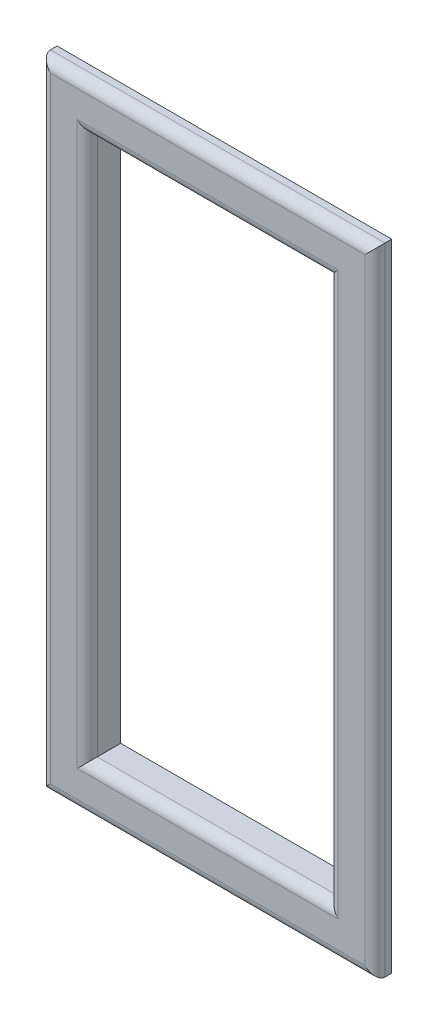
ISO-10303-21;
HEADER;
FILE_DESCRIPTION(('STEP AP214'),'2;1');
FILE_NAME('part.step','',(''),(''),'','','');
FILE_SCHEMA(('AUTOMOTIVE_DESIGN { 1 0 10303 214 1 1 1 1 }'));
ENDSEC;
DATA;
#1=APPLICATION_CONTEXT('core data for automotive mechanical design processes');
#2=APPLICATION_PROTOCOL_DEFINITION('international standard','automotive_design',2000,#1);
#3=PRODUCT_CONTEXT('',#1,'mechanical');
#4=PRODUCT('Part','Part','',(#3));
#5=PRODUCT_RELATED_PRODUCT_CATEGORY('part','',(#4));
#6=PRODUCT_DEFINITION_FORMATION('','',#4);
#7=PRODUCT_DEFINITION_CONTEXT('part definition',#1,'design');
#8=PRODUCT_DEFINITION('design','',#6,#7);
#9=PRODUCT_DEFINITION_SHAPE('','',#8);
#10=(LENGTH_UNIT() NAMED_UNIT(*) SI_UNIT(.MILLI.,.METRE.));
#11=(NAMED_UNIT(*) PLANE_ANGLE_UNIT() SI_UNIT($,.RADIAN.));
#12=(NAMED_UNIT(*) SI_UNIT($,.STERADIAN.) SOLID_ANGLE_UNIT());
#13=UNCERTAINTY_MEASURE_WITH_UNIT(LENGTH_MEASURE(1.E-05),#10,'distance_accuracy_value','');
#14=(GEOMETRIC_REPRESENTATION_CONTEXT(3) GLOBAL_UNCERTAINTY_ASSIGNED_CONTEXT((#13)) GLOBAL_UNIT_ASSIGNED_CONTEXT((#10,
#11,#12)) REPRESENTATION_CONTEXT('',''));
#15=CARTESIAN_POINT('',(0.,0.,0.));
#16=DIRECTION('',(0.,0.,1.));
#17=DIRECTION('',(1.,0.,0.));
#18=AXIS2_PLACEMENT_3D('',#15,#16,#17);
#19=CARTESIAN_POINT('',(-20.,-42.5,2.5));
#20=DIRECTION('',(1.,0.,0.));
#21=DIRECTION('',(0.,0.,-1.));
#22=AXIS2_PLACEMENT_3D('',#19,#20,#21);
#23=PLANE('',#22);
#24=DIRECTION('',(0.,-1.,0.));
#25=VECTOR('',#24,1.);
#26=CARTESIAN_POINT('',(-20.,-42.5,0.));
#27=LINE('',#26,#25);
#28=CARTESIAN_POINT('',(-20.,42.5,0.));
#29=VERTEX_POINT('',#28);
#30=CARTESIAN_POINT('',(-20.,-42.5,0.));
#31=VERTEX_POINT('',#30);
#32=EDGE_CURVE('E321',#29,#31,#27,.T.);
#33=ORIENTED_EDGE('',*,*,#32,.F.);
#34=DIRECTION('',(0.,0.,-1.));
#35=VECTOR('',#34,1.);
#36=CARTESIAN_POINT('',(-20.,42.5,2.5));
#37=LINE('',#36,#35);
#38=CARTESIAN_POINT('',(-20.,42.5,-2.5));
#39=VERTEX_POINT('',#38);
#40=EDGE_CURVE('E248',#29,#39,#37,.T.);
#41=ORIENTED_EDGE('',*,*,#40,.T.);
#42=DIRECTION('',(0.,-1.,0.));
#43=VECTOR('',#42,1.);
#44=CARTESIAN_POINT('',(-20.,-42.5,-2.5));
#45=LINE('',#44,#43);
#46=CARTESIAN_POINT('',(-20.,-42.5,-2.5));
#47=VERTEX_POINT('',#46);
#48=EDGE_CURVE('E232',#39,#47,#45,.T.);
#49=ORIENTED_EDGE('',*,*,#48,.T.);
#50=DIRECTION('',(0.,0.,-1.));
#51=VECTOR('',#50,1.);
#52=CARTESIAN_POINT('',(-20.,-42.5,2.5));
#53=LINE('',#52,#51);
#54=EDGE_CURVE('E257',#31,#47,#53,.T.);
#55=ORIENTED_EDGE('',*,*,#54,.F.);
#56=EDGE_LOOP('',(#33,#41,#49,#55));
#57=FACE_BOUND('',#56,.T.);
#58=ADVANCED_FACE('F45',(#57),#23,.F.);
#59=CARTESIAN_POINT('',(20.,-42.5,2.5));
#60=DIRECTION('',(0.,1.,0.));
#61=DIRECTION('',(0.,0.,1.));
#62=AXIS2_PLACEMENT_3D('',#59,#60,#61);
#63=PLANE('',#62);
#64=DIRECTION('',(1.,0.,0.));
#65=VECTOR('',#64,1.);
#66=CARTESIAN_POINT('',(20.,-42.5,0.));
#67=LINE('',#66,#65);
#68=CARTESIAN_POINT('',(20.,-42.5,0.));
#69=VERTEX_POINT('',#68);
#70=EDGE_CURVE('E542',#31,#69,#67,.T.);
#71=ORIENTED_EDGE('',*,*,#70,.F.);
#72=ORIENTED_EDGE('',*,*,#54,.T.);
#73=DIRECTION('',(1.,0.,0.));
#74=VECTOR('',#73,1.);
#75=CARTESIAN_POINT('',(20.,-42.5,-2.5));
#76=LINE('',#75,#74);
#77=CARTESIAN_POINT('',(20.,-42.5,-2.5));
#78=VERTEX_POINT('',#77);
#79=EDGE_CURVE('E236',#47,#78,#76,.T.);
#80=ORIENTED_EDGE('',*,*,#79,.T.);
#81=DIRECTION('',(0.,0.,-1.));
#82=VECTOR('',#81,1.);
#83=CARTESIAN_POINT('',(20.,-42.5,2.5));
#84=LINE('',#83,#82);
#85=EDGE_CURVE('E254',#69,#78,#84,.T.);
#86=ORIENTED_EDGE('',*,*,#85,.F.);
#87=EDGE_LOOP('',(#71,#72,#80,#86));
#88=FACE_BOUND('',#87,.T.);
#89=ADVANCED_FACE('F371',(#88),#63,.F.);
#90=CARTESIAN_POINT('',(20.,-42.5,2.5));
#91=DIRECTION('',(-1.,0.,0.));
#92=DIRECTION('',(0.,0.,1.));
#93=AXIS2_PLACEMENT_3D('',#90,#91,#92);
#94=PLANE('',#93);
#95=DIRECTION('',(0.,1.,0.));
#96=VECTOR('',#95,1.);
#97=CARTESIAN_POINT('',(20.,-42.5,0.));
#98=LINE('',#97,#96);
#99=CARTESIAN_POINT('',(20.,42.5,0.));
#100=VERTEX_POINT('',#99);
#101=EDGE_CURVE('E189',#69,#100,#98,.T.);
#102=ORIENTED_EDGE('',*,*,#101,.F.);
#103=ORIENTED_EDGE('',*,*,#85,.T.);
#104=DIRECTION('',(0.,1.,0.));
#105=VECTOR('',#104,1.);
#106=CARTESIAN_POINT('',(20.,-42.5,-2.5));
#107=LINE('',#106,#105);
#108=CARTESIAN_POINT('',(20.,42.5,-2.5));
#109=VERTEX_POINT('',#108);
#110=EDGE_CURVE('E240',#78,#109,#107,.T.);
#111=ORIENTED_EDGE('',*,*,#110,.T.);
#112=DIRECTION('',(0.,0.,-1.));
#113=VECTOR('',#112,1.);
#114=CARTESIAN_POINT('',(20.,42.5,2.5));
#115=LINE('',#114,#113);
#116=EDGE_CURVE('E251',#100,#109,#115,.T.);
#117=ORIENTED_EDGE('',*,*,#116,.F.);
#118=EDGE_LOOP('',(#102,#103,#111,#117));
#119=FACE_BOUND('',#118,.T.);
#120=ADVANCED_FACE('F366',(#119),#94,.F.);
#121=CARTESIAN_POINT('',(20.,42.5,2.5));
#122=DIRECTION('',(0.,-1.,0.));
#123=DIRECTION('',(0.,0.,-1.));
#124=AXIS2_PLACEMENT_3D('',#121,#122,#123);
#125=PLANE('',#124);
#126=DIRECTION('',(-1.,0.,0.));
#127=VECTOR('',#126,1.);
#128=CARTESIAN_POINT('',(20.,42.5,0.));
#129=LINE('',#128,#127);
#130=EDGE_CURVE('E185',#100,#29,#129,.T.);
#131=ORIENTED_EDGE('',*,*,#130,.F.);
#132=ORIENTED_EDGE('',*,*,#116,.T.);
#133=DIRECTION('',(-1.,0.,0.));
#134=VECTOR('',#133,1.);
#135=CARTESIAN_POINT('',(20.,42.5,-2.5));
#136=LINE('',#135,#134);
#137=EDGE_CURVE('E244',#109,#39,#136,.T.);
#138=ORIENTED_EDGE('',*,*,#137,.T.);
#139=ORIENTED_EDGE('',*,*,#40,.F.);
#140=EDGE_LOOP('',(#131,#132,#138,#139));
#141=FACE_BOUND('',#140,.T.);
#142=ADVANCED_FACE('F354',(#141),#125,.F.);
#143=CARTESIAN_POINT('',(0.,0.,2.5));
#144=DIRECTION('',(0.,0.,1.));
#145=DIRECTION('',(1.,0.,0.));
#146=AXIS2_PLACEMENT_3D('',#143,#144,#145);
#147=PLANE('',#146);
#148=DIRECTION('',(0.,1.,0.));
#149=VECTOR('',#148,1.);
#150=CARTESIAN_POINT('',(19.5,0.,2.5));
#151=LINE('',#150,#149);
#152=CARTESIAN_POINT('',(19.5,42.,2.5));
#153=VERTEX_POINT('',#152);
#154=CARTESIAN_POINT('',(19.5,-42.,2.5));
#155=VERTEX_POINT('',#154);
#156=EDGE_CURVE('E283',#153,#155,#151,.F.);
#157=ORIENTED_EDGE('',*,*,#156,.T.);
#158=DIRECTION('',(1.,0.,0.));
#159=VECTOR('',#158,1.);
#160=CARTESIAN_POINT('',(0.,-42.,2.5));
#161=LINE('',#160,#159);
#162=CARTESIAN_POINT('',(-19.5,-42.,2.5));
#163=VERTEX_POINT('',#162);
#164=EDGE_CURVE('E286',#155,#163,#161,.F.);
#165=ORIENTED_EDGE('',*,*,#164,.T.);
#166=DIRECTION('',(0.,-1.,0.));
#167=VECTOR('',#166,1.);
#168=CARTESIAN_POINT('',(-19.5,0.,2.5));
#169=LINE('',#168,#167);
#170=CARTESIAN_POINT('',(-19.5,42.,2.5));
#171=VERTEX_POINT('',#170);
#172=EDGE_CURVE('E280',#163,#171,#169,.F.);
#173=ORIENTED_EDGE('',*,*,#172,.T.);
#174=DIRECTION('',(-1.,0.,0.));
#175=VECTOR('',#174,1.);
#176=CARTESIAN_POINT('',(0.,42.,2.5));
#177=LINE('',#176,#175);
#178=EDGE_CURVE('E277',#171,#153,#177,.F.);
#179=ORIENTED_EDGE('',*,*,#178,.T.);
#180=EDGE_LOOP('',(#157,#165,#173,#179));
#181=FACE_BOUND('',#180,.T.);
#182=DIRECTION('',(0.,1.,0.));
#183=VECTOR('',#182,1.);
#184=CARTESIAN_POINT('',(23.5,47.5,2.5));
#185=LINE('',#184,#183);
#186=CARTESIAN_POINT('',(23.5,-46.,2.5));
#187=VERTEX_POINT('',#186);
#188=CARTESIAN_POINT('',(23.5,46.,2.5));
#189=VERTEX_POINT('',#188);
#190=EDGE_CURVE('E270',#187,#189,#185,.T.);
#191=ORIENTED_EDGE('',*,*,#190,.T.);
#192=DIRECTION('',(-1.,0.,0.));
#193=VECTOR('',#192,1.);
#194=CARTESIAN_POINT('',(-25.,46.,2.5));
#195=LINE('',#194,#193);
#196=CARTESIAN_POINT('',(-23.5,46.,2.5));
#197=VERTEX_POINT('',#196);
#198=EDGE_CURVE('E273',#189,#197,#195,.T.);
#199=ORIENTED_EDGE('',*,*,#198,.T.);
#200=DIRECTION('',(0.,-1.,0.));
#201=VECTOR('',#200,1.);
#202=CARTESIAN_POINT('',(-23.5,-47.5,2.5));
#203=LINE('',#202,#201);
#204=CARTESIAN_POINT('',(-23.5,-46.,2.5));
#205=VERTEX_POINT('',#204);
#206=EDGE_CURVE('E267',#197,#205,#203,.T.);
#207=ORIENTED_EDGE('',*,*,#206,.T.);
#208=DIRECTION('',(1.,0.,0.));
#209=VECTOR('',#208,1.);
#210=CARTESIAN_POINT('',(25.,-46.,2.5));
#211=LINE('',#210,#209);
#212=EDGE_CURVE('E264',#205,#187,#211,.T.);
#213=ORIENTED_EDGE('',*,*,#212,.T.);
#214=EDGE_LOOP('',(#191,#199,#207,#213));
#215=FACE_BOUND('',#214,.T.);
#216=ADVANCED_FACE('F351',(#181,#215),#147,.T.);
#217=CARTESIAN_POINT('',(0.,0.,-2.5));
#218=DIRECTION('',(0.,0.,1.));
#219=DIRECTION('',(1.,0.,0.));
#220=AXIS2_PLACEMENT_3D('',#217,#218,#219);
#221=PLANE('',#220);
#222=ORIENTED_EDGE('',*,*,#48,.F.);
#223=ORIENTED_EDGE('',*,*,#137,.F.);
#224=ORIENTED_EDGE('',*,*,#110,.F.);
#225=ORIENTED_EDGE('',*,*,#79,.F.);
#226=EDGE_LOOP('',(#222,#223,#224,#225));
#227=FACE_BOUND('',#226,.T.);
#228=DIRECTION('',(0.,-1.,0.));
#229=VECTOR('',#228,1.);
#230=CARTESIAN_POINT('',(-18.,-40.5,-2.5));
#231=LINE('',#230,#229);
#232=CARTESIAN_POINT('',(-18.,40.5,-2.5));
#233=VERTEX_POINT('',#232);
#234=CARTESIAN_POINT('',(-18.,-40.5,-2.5));
#235=VERTEX_POINT('',#234);
#236=EDGE_CURVE('E167',#233,#235,#231,.T.);
#237=ORIENTED_EDGE('',*,*,#236,.T.);
#238=DIRECTION('',(1.,0.,0.));
#239=VECTOR('',#238,1.);
#240=CARTESIAN_POINT('',(18.,-40.5,-2.5));
#241=LINE('',#240,#239);
#242=CARTESIAN_POINT('',(18.,-40.5,-2.5));
#243=VERTEX_POINT('',#242);
#244=EDGE_CURVE('E208',#235,#243,#241,.T.);
#245=ORIENTED_EDGE('',*,*,#244,.T.);
#246=DIRECTION('',(0.,1.,0.));
#247=VECTOR('',#246,1.);
#248=CARTESIAN_POINT('',(18.,-40.5,-2.5));
#249=LINE('',#248,#247);
#250=CARTESIAN_POINT('',(18.,40.5,-2.5));
#251=VERTEX_POINT('',#250);
#252=EDGE_CURVE('E212',#243,#251,#249,.T.);
#253=ORIENTED_EDGE('',*,*,#252,.T.);
#254=DIRECTION('',(-1.,0.,0.));
#255=VECTOR('',#254,1.);
#256=CARTESIAN_POINT('',(18.,40.5,-2.5));
#257=LINE('',#256,#255);
#258=EDGE_CURVE('E216',#251,#233,#257,.T.);
#259=ORIENTED_EDGE('',*,*,#258,.T.);
#260=EDGE_LOOP('',(#237,#245,#253,#259));
#261=FACE_BOUND('',#260,.T.);
#262=ADVANCED_FACE('F353',(#227,#261),#221,.F.);
#263=CARTESIAN_POINT('',(-18.,-40.5,2.5));
#264=DIRECTION('',(1.,0.,0.));
#265=DIRECTION('',(0.,0.,-1.));
#266=AXIS2_PLACEMENT_3D('',#263,#264,#265);
#267=PLANE('',#266);
#268=DIRECTION('',(0.,0.,-1.));
#269=VECTOR('',#268,1.);
#270=CARTESIAN_POINT('',(-18.,40.5,2.5));
#271=LINE('',#270,#269);
#272=CARTESIAN_POINT('',(-18.,40.5,1.));
#273=VERTEX_POINT('',#272);
#274=EDGE_CURVE('E220',#273,#233,#271,.T.);
#275=ORIENTED_EDGE('',*,*,#274,.F.);
#276=DIRECTION('',(0.,-1.,0.));
#277=VECTOR('',#276,1.);
#278=CARTESIAN_POINT('',(-18.,-40.5,1.));
#279=LINE('',#278,#277);
#280=CARTESIAN_POINT('',(-18.,-40.5,1.));
#281=VERTEX_POINT('',#280);
#282=EDGE_CURVE('E293',#273,#281,#279,.T.);
#283=ORIENTED_EDGE('',*,*,#282,.T.);
#284=DIRECTION('',(0.,0.,-1.));
#285=VECTOR('',#284,1.);
#286=CARTESIAN_POINT('',(-18.,-40.5,2.5));
#287=LINE('',#286,#285);
#288=EDGE_CURVE('E229',#281,#235,#287,.T.);
#289=ORIENTED_EDGE('',*,*,#288,.T.);
#290=ORIENTED_EDGE('',*,*,#236,.F.);
#291=EDGE_LOOP('',(#275,#283,#289,#290));
#292=FACE_BOUND('',#291,.T.);
#293=ADVANCED_FACE('F362',(#292),#267,.T.);
#294=CARTESIAN_POINT('',(18.,-40.5,2.5));
#295=DIRECTION('',(0.,1.,0.));
#296=DIRECTION('',(0.,0.,1.));
#297=AXIS2_PLACEMENT_3D('',#294,#295,#296);
#298=PLANE('',#297);
#299=ORIENTED_EDGE('',*,*,#288,.F.);
#300=DIRECTION('',(1.,0.,0.));
#301=VECTOR('',#300,1.);
#302=CARTESIAN_POINT('',(18.,-40.5,1.));
#303=LINE('',#302,#301);
#304=CARTESIAN_POINT('',(18.,-40.5,1.));
#305=VERTEX_POINT('',#304);
#306=EDGE_CURVE('E260',#281,#305,#303,.T.);
#307=ORIENTED_EDGE('',*,*,#306,.T.);
#308=DIRECTION('',(0.,0.,-1.));
#309=VECTOR('',#308,1.);
#310=CARTESIAN_POINT('',(18.,-40.5,2.5));
#311=LINE('',#310,#309);
#312=EDGE_CURVE('E226',#305,#243,#311,.T.);
#313=ORIENTED_EDGE('',*,*,#312,.T.);
#314=ORIENTED_EDGE('',*,*,#244,.F.);
#315=EDGE_LOOP('',(#299,#307,#313,#314));
#316=FACE_BOUND('',#315,.T.);
#317=ADVANCED_FACE('F475',(#316),#298,.T.);
#318=CARTESIAN_POINT('',(18.,-40.5,2.5));
#319=DIRECTION('',(-1.,0.,0.));
#320=DIRECTION('',(0.,0.,1.));
#321=AXIS2_PLACEMENT_3D('',#318,#319,#320);
#322=PLANE('',#321);
#323=ORIENTED_EDGE('',*,*,#312,.F.);
#324=DIRECTION('',(0.,1.,0.));
#325=VECTOR('',#324,1.);
#326=CARTESIAN_POINT('',(18.,-40.5,1.));
#327=LINE('',#326,#325);
#328=CARTESIAN_POINT('',(18.,40.5,1.));
#329=VERTEX_POINT('',#328);
#330=EDGE_CURVE('E290',#305,#329,#327,.T.);
#331=ORIENTED_EDGE('',*,*,#330,.T.);
#332=DIRECTION('',(0.,0.,-1.));
#333=VECTOR('',#332,1.);
#334=CARTESIAN_POINT('',(18.,40.5,2.5));
#335=LINE('',#334,#333);
#336=EDGE_CURVE('E223',#329,#251,#335,.T.);
#337=ORIENTED_EDGE('',*,*,#336,.T.);
#338=ORIENTED_EDGE('',*,*,#252,.F.);
#339=EDGE_LOOP('',(#323,#331,#337,#338));
#340=FACE_BOUND('',#339,.T.);
#341=ADVANCED_FACE('F465',(#340),#322,.T.);
#342=CARTESIAN_POINT('',(18.,40.5,2.5));
#343=DIRECTION('',(0.,-1.,0.));
#344=DIRECTION('',(0.,0.,-1.));
#345=AXIS2_PLACEMENT_3D('',#342,#343,#344);
#346=PLANE('',#345);
#347=ORIENTED_EDGE('',*,*,#336,.F.);
#348=DIRECTION('',(-1.,0.,0.));
#349=VECTOR('',#348,1.);
#350=CARTESIAN_POINT('',(18.,40.5,1.));
#351=LINE('',#350,#349);
#352=EDGE_CURVE('E296',#329,#273,#351,.T.);
#353=ORIENTED_EDGE('',*,*,#352,.T.);
#354=ORIENTED_EDGE('',*,*,#274,.T.);
#355=ORIENTED_EDGE('',*,*,#258,.F.);
#356=EDGE_LOOP('',(#347,#353,#354,#355));
#357=FACE_BOUND('',#356,.T.);
#358=ADVANCED_FACE('F461',(#357),#346,.T.);
#359=CARTESIAN_POINT('',(0.,0.,0.));
#360=DIRECTION('',(0.,0.,1.));
#361=DIRECTION('',(1.,0.,0.));
#362=AXIS2_PLACEMENT_3D('',#359,#360,#361);
#363=PLANE('',#362);
#364=DIRECTION('',(0.,-1.,0.));
#365=VECTOR('',#364,1.);
#366=CARTESIAN_POINT('',(-25.,-47.5,0.));
#367=LINE('',#366,#365);
#368=CARTESIAN_POINT('',(-25.,47.5,0.));
#369=VERTEX_POINT('',#368);
#370=CARTESIAN_POINT('',(-25.,-47.5,0.));
#371=VERTEX_POINT('',#370);
#372=EDGE_CURVE('E175',#369,#371,#367,.T.);
#373=ORIENTED_EDGE('',*,*,#372,.F.);
#374=DIRECTION('',(-1.,0.,0.));
#375=VECTOR('',#374,1.);
#376=CARTESIAN_POINT('',(25.,47.5,0.));
#377=LINE('',#376,#375);
#378=CARTESIAN_POINT('',(25.,47.5,0.));
#379=VERTEX_POINT('',#378);
#380=EDGE_CURVE('E195',#379,#369,#377,.T.);
#381=ORIENTED_EDGE('',*,*,#380,.F.);
#382=DIRECTION('',(0.,1.,0.));
#383=VECTOR('',#382,1.);
#384=CARTESIAN_POINT('',(25.,-47.5,0.));
#385=LINE('',#384,#383);
#386=CARTESIAN_POINT('',(25.,-47.5,0.));
#387=VERTEX_POINT('',#386);
#388=EDGE_CURVE('E177',#387,#379,#385,.T.);
#389=ORIENTED_EDGE('',*,*,#388,.F.);
#390=DIRECTION('',(1.,0.,0.));
#391=VECTOR('',#390,1.);
#392=CARTESIAN_POINT('',(25.,-47.5,0.));
#393=LINE('',#392,#391);
#394=EDGE_CURVE('E161',#371,#387,#393,.T.);
#395=ORIENTED_EDGE('',*,*,#394,.F.);
#396=EDGE_LOOP('',(#373,#381,#389,#395));
#397=FACE_BOUND('',#396,.T.);
#398=ORIENTED_EDGE('',*,*,#32,.T.);
#399=ORIENTED_EDGE('',*,*,#70,.T.);
#400=ORIENTED_EDGE('',*,*,#101,.T.);
#401=ORIENTED_EDGE('',*,*,#130,.T.);
#402=EDGE_LOOP('',(#398,#399,#400,#401));
#403=FACE_BOUND('',#402,.T.);
#404=ADVANCED_FACE('F172',(#397,#403),#363,.F.);
#405=CARTESIAN_POINT('',(-25.,-47.5,2.5));
#406=DIRECTION('',(1.,0.,0.));
#407=DIRECTION('',(0.,0.,-1.));
#408=AXIS2_PLACEMENT_3D('',#405,#406,#407);
#409=PLANE('',#408);
#410=DIRECTION('',(0.,0.,-1.));
#411=VECTOR('',#410,1.);
#412=CARTESIAN_POINT('',(-25.,-47.5,2.5));
#413=LINE('',#412,#411);
#414=CARTESIAN_POINT('',(-25.,-47.5,1.));
#415=VERTEX_POINT('',#414);
#416=EDGE_CURVE('E158',#415,#371,#413,.T.);
#417=ORIENTED_EDGE('',*,*,#416,.F.);
#418=DIRECTION('',(0.,-1.,0.));
#419=VECTOR('',#418,1.);
#420=CARTESIAN_POINT('',(-25.,47.5,1.));
#421=LINE('',#420,#419);
#422=CARTESIAN_POINT('',(-25.,47.5,1.));
#423=VERTEX_POINT('',#422);
#424=EDGE_CURVE('E55',#415,#423,#421,.F.);
#425=ORIENTED_EDGE('',*,*,#424,.T.);
#426=DIRECTION('',(0.,0.,-1.));
#427=VECTOR('',#426,1.);
#428=CARTESIAN_POINT('',(-25.,47.5,2.5));
#429=LINE('',#428,#427);
#430=EDGE_CURVE('E182',#423,#369,#429,.T.);
#431=ORIENTED_EDGE('',*,*,#430,.T.);
#432=ORIENTED_EDGE('',*,*,#372,.T.);
#433=EDGE_LOOP('',(#417,#425,#431,#432));
#434=FACE_BOUND('',#433,.T.);
#435=ADVANCED_FACE('F180',(#434),#409,.F.);
#436=CARTESIAN_POINT('',(25.,-47.5,2.5));
#437=DIRECTION('',(0.,1.,0.));
#438=DIRECTION('',(0.,0.,1.));
#439=AXIS2_PLACEMENT_3D('',#436,#437,#438);
#440=PLANE('',#439);
#441=DIRECTION('',(0.,0.,-1.));
#442=VECTOR('',#441,1.);
#443=CARTESIAN_POINT('',(25.,-47.5,2.5));
#444=LINE('',#443,#442);
#445=CARTESIAN_POINT('',(25.,-47.5,1.));
#446=VERTEX_POINT('',#445);
#447=EDGE_CURVE('E168',#446,#387,#444,.T.);
#448=ORIENTED_EDGE('',*,*,#447,.F.);
#449=DIRECTION('',(1.,0.,0.));
#450=VECTOR('',#449,1.);
#451=CARTESIAN_POINT('',(-25.,-47.5,1.));
#452=LINE('',#451,#450);
#453=EDGE_CURVE('E11',#446,#415,#452,.F.);
#454=ORIENTED_EDGE('',*,*,#453,.T.);
#455=ORIENTED_EDGE('',*,*,#416,.T.);
#456=ORIENTED_EDGE('',*,*,#394,.T.);
#457=EDGE_LOOP('',(#448,#454,#455,#456));
#458=FACE_BOUND('',#457,.T.);
#459=ADVANCED_FACE('F160',(#458),#440,.F.);
#460=CARTESIAN_POINT('',(25.,-47.5,2.5));
#461=DIRECTION('',(-1.,0.,0.));
#462=DIRECTION('',(0.,0.,1.));
#463=AXIS2_PLACEMENT_3D('',#460,#461,#462);
#464=PLANE('',#463);
#465=DIRECTION('',(0.,0.,-1.));
#466=VECTOR('',#465,1.);
#467=CARTESIAN_POINT('',(25.,47.5,2.5));
#468=LINE('',#467,#466);
#469=CARTESIAN_POINT('',(25.,47.5,1.));
#470=VERTEX_POINT('',#469);
#471=EDGE_CURVE('E200',#470,#379,#468,.T.);
#472=ORIENTED_EDGE('',*,*,#471,.F.);
#473=DIRECTION('',(0.,1.,0.));
#474=VECTOR('',#473,1.);
#475=CARTESIAN_POINT('',(25.,-47.5,1.));
#476=LINE('',#475,#474);
#477=EDGE_CURVE('E69',#470,#446,#476,.F.);
#478=ORIENTED_EDGE('',*,*,#477,.T.);
#479=ORIENTED_EDGE('',*,*,#447,.T.);
#480=ORIENTED_EDGE('',*,*,#388,.T.);
#481=EDGE_LOOP('',(#472,#478,#479,#480));
#482=FACE_BOUND('',#481,.T.);
#483=ADVANCED_FACE('F434',(#482),#464,.F.);
#484=CARTESIAN_POINT('',(25.,47.5,2.5));
#485=DIRECTION('',(0.,-1.,0.));
#486=DIRECTION('',(0.,0.,-1.));
#487=AXIS2_PLACEMENT_3D('',#484,#485,#486);
#488=PLANE('',#487);
#489=ORIENTED_EDGE('',*,*,#430,.F.);
#490=DIRECTION('',(-1.,0.,0.));
#491=VECTOR('',#490,1.);
#492=CARTESIAN_POINT('',(25.,47.5,1.));
#493=LINE('',#492,#491);
#494=EDGE_CURVE('E299',#423,#470,#493,.F.);
#495=ORIENTED_EDGE('',*,*,#494,.T.);
#496=ORIENTED_EDGE('',*,*,#471,.T.);
#497=ORIENTED_EDGE('',*,*,#380,.T.);
#498=EDGE_LOOP('',(#489,#495,#496,#497));
#499=FACE_BOUND('',#498,.T.);
#500=ADVANCED_FACE('F346',(#499),#488,.F.);
#501=CARTESIAN_POINT('',(18.,42.,1.));
#502=DIRECTION('',(-1.,0.,0.));
#503=DIRECTION('',(0.,0.,1.));
#504=AXIS2_PLACEMENT_3D('',#501,#502,#503);
#505=CYLINDRICAL_SURFACE('',#504,1.5);
#506=CARTESIAN_POINT('',(19.5,42.,1.));
#507=DIRECTION('',(-0.707106781186547,0.707106781186547,0.));
#508=DIRECTION('',(0.707106781186547,0.707106781186547,0.));
#509=AXIS2_PLACEMENT_3D('',#506,#507,#508);
#510=ELLIPSE('',#509,2.12132034355964,1.5);
#511=EDGE_CURVE('E313',#153,#329,#510,.F.);
#512=ORIENTED_EDGE('',*,*,#511,.F.);
#513=ORIENTED_EDGE('',*,*,#178,.F.);
#514=CARTESIAN_POINT('',(-19.5,42.,1.));
#515=DIRECTION('',(-0.707106781186547,-0.707106781186547,0.));
#516=DIRECTION('',(0.707106781186547,-0.707106781186547,0.));
#517=AXIS2_PLACEMENT_3D('',#514,#515,#516);
#518=ELLIPSE('',#517,2.12132034355964,1.5);
#519=EDGE_CURVE('E317',#273,#171,#518,.T.);
#520=ORIENTED_EDGE('',*,*,#519,.F.);
#521=ORIENTED_EDGE('',*,*,#352,.F.);
#522=EDGE_LOOP('',(#512,#513,#520,#521));
#523=FACE_BOUND('',#522,.T.);
#524=ADVANCED_FACE('F393',(#523),#505,.T.);
#525=CARTESIAN_POINT('',(-19.5,-40.5,1.));
#526=DIRECTION('',(0.,-1.,0.));
#527=DIRECTION('',(0.,0.,-1.));
#528=AXIS2_PLACEMENT_3D('',#525,#526,#527);
#529=CYLINDRICAL_SURFACE('',#528,1.5);
#530=ORIENTED_EDGE('',*,*,#519,.T.);
#531=ORIENTED_EDGE('',*,*,#172,.F.);
#532=CARTESIAN_POINT('',(-19.5,-42.,1.));
#533=DIRECTION('',(0.707106781186547,-0.707106781186547,0.));
#534=DIRECTION('',(0.707106781186547,0.707106781186547,0.));
#535=AXIS2_PLACEMENT_3D('',#532,#533,#534);
#536=ELLIPSE('',#535,2.12132034355964,1.5);
#537=EDGE_CURVE('E310',#281,#163,#536,.T.);
#538=ORIENTED_EDGE('',*,*,#537,.F.);
#539=ORIENTED_EDGE('',*,*,#282,.F.);
#540=EDGE_LOOP('',(#530,#531,#538,#539));
#541=FACE_BOUND('',#540,.T.);
#542=ADVANCED_FACE('F389',(#541),#529,.T.);
#543=CARTESIAN_POINT('',(19.5,-40.5,1.));
#544=DIRECTION('',(0.,1.,0.));
#545=DIRECTION('',(0.,0.,1.));
#546=AXIS2_PLACEMENT_3D('',#543,#544,#545);
#547=CYLINDRICAL_SURFACE('',#546,1.5);
#548=ORIENTED_EDGE('',*,*,#511,.T.);
#549=ORIENTED_EDGE('',*,*,#330,.F.);
#550=CARTESIAN_POINT('',(19.5,-42.,1.));
#551=DIRECTION('',(0.707106781186547,0.707106781186547,0.));
#552=DIRECTION('',(0.707106781186547,-0.707106781186547,0.));
#553=AXIS2_PLACEMENT_3D('',#550,#551,#552);
#554=ELLIPSE('',#553,2.12132034355964,1.5);
#555=EDGE_CURVE('E307',#155,#305,#554,.F.);
#556=ORIENTED_EDGE('',*,*,#555,.F.);
#557=ORIENTED_EDGE('',*,*,#156,.F.);
#558=EDGE_LOOP('',(#548,#549,#556,#557));
#559=FACE_BOUND('',#558,.T.);
#560=ADVANCED_FACE('F385',(#559),#547,.T.);
#561=CARTESIAN_POINT('',(18.,-42.,1.));
#562=DIRECTION('',(1.,0.,0.));
#563=DIRECTION('',(0.,0.,-1.));
#564=AXIS2_PLACEMENT_3D('',#561,#562,#563);
#565=CYLINDRICAL_SURFACE('',#564,1.5);
#566=ORIENTED_EDGE('',*,*,#537,.T.);
#567=ORIENTED_EDGE('',*,*,#164,.F.);
#568=ORIENTED_EDGE('',*,*,#555,.T.);
#569=ORIENTED_EDGE('',*,*,#306,.F.);
#570=EDGE_LOOP('',(#566,#567,#568,#569));
#571=FACE_BOUND('',#570,.T.);
#572=ADVANCED_FACE('F382',(#571),#565,.T.);
#573=CARTESIAN_POINT('',(0.,-46.,1.));
#574=DIRECTION('',(-1.,0.,0.));
#575=DIRECTION('',(0.,0.,1.));
#576=AXIS2_PLACEMENT_3D('',#573,#574,#575);
#577=CYLINDRICAL_SURFACE('',#576,1.5);
#578=CARTESIAN_POINT('',(-23.5,-46.,1.));
#579=DIRECTION('',(-0.707106781186547,0.707106781186547,0.));
#580=DIRECTION('',(-0.707106781186547,-0.707106781186547,0.));
#581=AXIS2_PLACEMENT_3D('',#578,#579,#580);
#582=ELLIPSE('',#581,2.12132034355964,1.5);
#583=EDGE_CURVE('E327',#415,#205,#582,.T.);
#584=ORIENTED_EDGE('',*,*,#583,.F.);
#585=ORIENTED_EDGE('',*,*,#453,.F.);
#586=CARTESIAN_POINT('',(23.5,-46.,1.));
#587=DIRECTION('',(-0.707106781186547,-0.707106781186547,0.));
#588=DIRECTION('',(-0.707106781186547,0.707106781186547,0.));
#589=AXIS2_PLACEMENT_3D('',#586,#587,#588);
#590=ELLIPSE('',#589,2.12132034355964,1.5);
#591=EDGE_CURVE('E49',#187,#446,#590,.F.);
#592=ORIENTED_EDGE('',*,*,#591,.F.);
#593=ORIENTED_EDGE('',*,*,#212,.F.);
#594=EDGE_LOOP('',(#584,#585,#592,#593));
#595=FACE_BOUND('',#594,.T.);
#596=ADVANCED_FACE('F47',(#595),#577,.T.);
#597=CARTESIAN_POINT('',(23.5,0.,1.));
#598=DIRECTION('',(0.,-1.,0.));
#599=DIRECTION('',(0.,0.,-1.));
#600=AXIS2_PLACEMENT_3D('',#597,#598,#599);
#601=CYLINDRICAL_SURFACE('',#600,1.5);
#602=ORIENTED_EDGE('',*,*,#591,.T.);
#603=ORIENTED_EDGE('',*,*,#477,.F.);
#604=CARTESIAN_POINT('',(23.5,46.,1.));
#605=DIRECTION('',(0.707106781186547,-0.707106781186547,0.));
#606=DIRECTION('',(-0.707106781186547,-0.707106781186547,0.));
#607=AXIS2_PLACEMENT_3D('',#604,#605,#606);
#608=ELLIPSE('',#607,2.12132034355964,1.5);
#609=EDGE_CURVE('E325',#189,#470,#608,.F.);
#610=ORIENTED_EDGE('',*,*,#609,.F.);
#611=ORIENTED_EDGE('',*,*,#190,.F.);
#612=EDGE_LOOP('',(#602,#603,#610,#611));
#613=FACE_BOUND('',#612,.T.);
#614=ADVANCED_FACE('F338',(#613),#601,.T.);
#615=CARTESIAN_POINT('',(-23.5,0.,1.));
#616=DIRECTION('',(0.,1.,0.));
#617=DIRECTION('',(0.,0.,1.));
#618=AXIS2_PLACEMENT_3D('',#615,#616,#617);
#619=CYLINDRICAL_SURFACE('',#618,1.5);
#620=ORIENTED_EDGE('',*,*,#583,.T.);
#621=ORIENTED_EDGE('',*,*,#206,.F.);
#622=CARTESIAN_POINT('',(-23.5,46.,1.));
#623=DIRECTION('',(0.707106781186547,0.707106781186547,0.));
#624=DIRECTION('',(-0.707106781186547,0.707106781186547,0.));
#625=AXIS2_PLACEMENT_3D('',#622,#623,#624);
#626=ELLIPSE('',#625,2.12132034355964,1.5);
#627=EDGE_CURVE('E322',#423,#197,#626,.T.);
#628=ORIENTED_EDGE('',*,*,#627,.F.);
#629=ORIENTED_EDGE('',*,*,#424,.F.);
#630=EDGE_LOOP('',(#620,#621,#628,#629));
#631=FACE_BOUND('',#630,.T.);
#632=ADVANCED_FACE('F343',(#631),#619,.T.);
#633=CARTESIAN_POINT('',(0.,46.,1.));
#634=DIRECTION('',(1.,0.,0.));
#635=DIRECTION('',(0.,0.,-1.));
#636=AXIS2_PLACEMENT_3D('',#633,#634,#635);
#637=CYLINDRICAL_SURFACE('',#636,1.5);
#638=ORIENTED_EDGE('',*,*,#609,.T.);
#639=ORIENTED_EDGE('',*,*,#494,.F.);
#640=ORIENTED_EDGE('',*,*,#627,.T.);
#641=ORIENTED_EDGE('',*,*,#198,.F.);
#642=EDGE_LOOP('',(#638,#639,#640,#641));
#643=FACE_BOUND('',#642,.T.);
#644=ADVANCED_FACE('F348',(#643),#637,.T.);
#645=CLOSED_SHELL('',(#58,#89,#120,#142,#216,#262,#293,#317,#341,#358,#404,#435,#459,#483,#500,
#524,#542,#560,#572,#596,#614,#632,#644));
#646=MANIFOLD_SOLID_BREP('B2',#645);
#647=ADVANCED_BREP_SHAPE_REPRESENTATION('',(#18,#646),#14);
#648=SHAPE_DEFINITION_REPRESENTATION(#9,#647);
ENDSEC;
END-ISO-10303-21;
